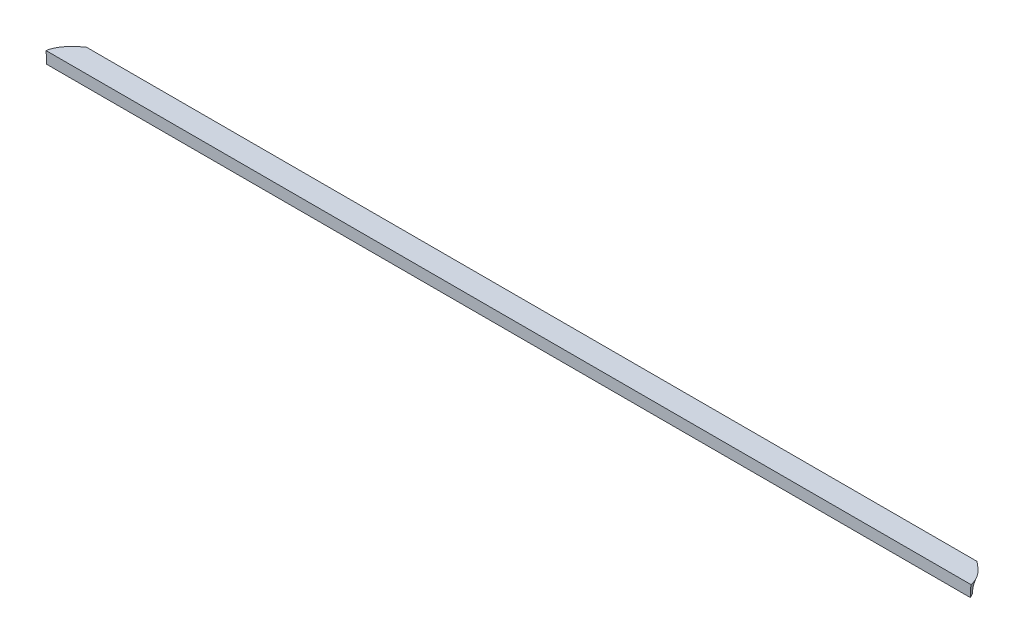
ISO-10303-21;
HEADER;
FILE_DESCRIPTION(('STEP AP214'),'2;1');
FILE_NAME('part.step','',(''),(''),'','','');
FILE_SCHEMA(('AUTOMOTIVE_DESIGN { 1 0 10303 214 1 1 1 1 }'));
ENDSEC;
DATA;
#1=APPLICATION_CONTEXT('core data for automotive mechanical design processes');
#2=APPLICATION_PROTOCOL_DEFINITION('international standard','automotive_design',2000,#1);
#3=PRODUCT_CONTEXT('',#1,'mechanical');
#4=PRODUCT('Part','Part','',(#3));
#5=PRODUCT_RELATED_PRODUCT_CATEGORY('part','',(#4));
#6=PRODUCT_DEFINITION_FORMATION('','',#4);
#7=PRODUCT_DEFINITION_CONTEXT('part definition',#1,'design');
#8=PRODUCT_DEFINITION('design','',#6,#7);
#9=PRODUCT_DEFINITION_SHAPE('','',#8);
#10=(LENGTH_UNIT() NAMED_UNIT(*) SI_UNIT(.MILLI.,.METRE.));
#11=(NAMED_UNIT(*) PLANE_ANGLE_UNIT() SI_UNIT($,.RADIAN.));
#12=(NAMED_UNIT(*) SI_UNIT($,.STERADIAN.) SOLID_ANGLE_UNIT());
#13=UNCERTAINTY_MEASURE_WITH_UNIT(LENGTH_MEASURE(1.E-05),#10,'distance_accuracy_value','');
#14=(GEOMETRIC_REPRESENTATION_CONTEXT(3) GLOBAL_UNCERTAINTY_ASSIGNED_CONTEXT((#13)) GLOBAL_UNIT_ASSIGNED_CONTEXT((#10,
#11,#12)) REPRESENTATION_CONTEXT('',''));
#15=CARTESIAN_POINT('',(0.,0.,0.));
#16=DIRECTION('',(0.,0.,1.));
#17=DIRECTION('',(1.,0.,0.));
#18=AXIS2_PLACEMENT_3D('',#15,#16,#17);
#19=CARTESIAN_POINT('',(-66.9058147928889,-2.,86.9637403470439));
#20=DIRECTION('',(1.,0.,0.));
#21=DIRECTION('',(0.,0.,-1.));
#22=AXIS2_PLACEMENT_3D('',#19,#20,#21);
#23=TOROIDAL_SURFACE('',#22,5.,3.);
#24=CARTESIAN_POINT('',(-69.9058147928889,0.999999999999997,90.9637403470439));
#25=CARTESIAN_POINT('',(-69.9058147928889,0.666480845146401,90.9637403470439));
#26=CARTESIAN_POINT('',(-69.877525242366,0.249164802214041,90.9637403470439));
#27=CARTESIAN_POINT('',(-69.8625755166707,0.0286324765040209,90.9637403470439));
#28=CARTESIAN_POINT('',(-69.8161638643568,-0.499778986061336,90.9637403470439));
#29=CARTESIAN_POINT('',(-69.7745955767013,-0.97304719741045,90.9637403470439));
#30=CARTESIAN_POINT('',(-69.7579941469615,-1.24890530846617,90.9637403470439));
#31=CARTESIAN_POINT('',(-69.7342419176351,-1.64358487631128,90.9637403470439));
#32=CARTESIAN_POINT('',(-69.7342419176351,-2.,90.9637403470439));
#33=B_SPLINE_CURVE_WITH_KNOTS('',2,(#24,#25,#26,#27,#28,#29,#30,#31,#32),.UNSPECIFIED.,.F.,.F.,
(3,2,2,2,3),(0.,0.25,0.5,0.75,1.),.UNSPECIFIED.);
#34=CARTESIAN_POINT('',(-69.8588030308181,3.01634316265606E-06,90.9635936772338));
#35=VERTEX_POINT('',#34);
#36=CARTESIAN_POINT('',(-69.7342419176351,-2.,90.9637403470439));
#37=VERTEX_POINT('',#36);
#38=EDGE_CURVE('E107',#35,#37,#33,.T.);
#39=ORIENTED_EDGE('',*,*,#38,.F.);
#40=CARTESIAN_POINT('',(-66.9058147928889,0.,86.9637403470439));
#41=CARTESIAN_POINT('',(-66.9086431982653,0.,86.9660497223522));
#42=CARTESIAN_POINT('',(-66.9114716255801,0.,86.9683591236709));
#43=CARTESIAN_POINT('',(-67.2821647550378,-4.64391994805597E-13,87.271032105808));
#44=CARTESIAN_POINT('',(-67.6502473120726,-1.01863606319856E-13,87.5719992009598));
#45=CARTESIAN_POINT('',(-68.1724523069411,0.,88.0559403173067));
#46=CARTESIAN_POINT('',(-68.3413779735427,0.,88.2224838102194));
#47=CARTESIAN_POINT('',(-68.6633705358107,0.,88.5700854873986));
#48=CARTESIAN_POINT('',(-68.8164560081418,0.,88.7511262174139));
#49=CARTESIAN_POINT('',(-69.1045977383734,0.,89.1357253248787));
#50=CARTESIAN_POINT('',(-69.2390069899249,0.,89.3397824035791));
#51=CARTESIAN_POINT('',(-69.4170017387718,0.,89.6587788868157));
#52=CARTESIAN_POINT('',(-69.4723766370238,0.,89.7672097182169));
#53=CARTESIAN_POINT('',(-69.5743527906943,0.,89.9881009368391));
#54=CARTESIAN_POINT('',(-69.6209578239052,0.,90.1005595640424));
#55=CARTESIAN_POINT('',(-69.7047058088721,0.,90.3296983113748));
#56=CARTESIAN_POINT('',(-69.7417926905651,0.,90.4463990227005));
#57=CARTESIAN_POINT('',(-69.8052486582005,0.,90.6826604533447));
#58=CARTESIAN_POINT('',(-69.8316208474269,0.,90.8022203339274));
#59=CARTESIAN_POINT('',(-69.8730632182671,0.,91.0446109353093));
#60=CARTESIAN_POINT('',(-69.8880109544736,0.,91.1674628733767));
#61=CARTESIAN_POINT('',(-69.9054859797905,0.,91.4142054398523));
#62=CARTESIAN_POINT('',(-69.9079963230803,0.,91.5380972551425));
#63=CARTESIAN_POINT('',(-69.9039384310851,0.,91.6618393249836));
#64=B_SPLINE_CURVE_WITH_KNOTS('',3,(#40,#41,#42,#43,#44,#45,#46,#47,#48,#49,#50,#51,#52,#53,#54,
#55,#56,#57,#58,#59,#60,#61,#62,#63),.UNSPECIFIED.,.F.,.F.,(4,2,2,2,2,2,2,2,2,2,2,4),(0.,
0.0109544511501086,1.4356816827656,2.14660492174934,2.85668474027996,3.58723574257017,
3.95217376099224,4.31695421347691,4.68383661237107,5.05061267566349,5.4212666987021,
5.7924255954428),.UNSPECIFIED.);
#65=CARTESIAN_POINT('',(-66.9058147928889,0.,86.9637403470439));
#66=VERTEX_POINT('',#65);
#67=EDGE_CURVE('E95',#35,#66,#64,.F.);
#68=ORIENTED_EDGE('',*,*,#67,.T.);
#69=CARTESIAN_POINT('',(-66.9058147928889,-2.,86.9637403470439));
#70=DIRECTION('',(1.,0.,0.));
#71=DIRECTION('',(0.,0.,-1.));
#72=AXIS2_PLACEMENT_3D('',#69,#70,#71);
#73=CIRCLE('',#72,2.);
#74=CARTESIAN_POINT('',(-66.9058147928889,-2.,88.9637403470439));
#75=VERTEX_POINT('',#74);
#76=EDGE_CURVE('E159',#75,#66,#73,.F.);
#77=ORIENTED_EDGE('',*,*,#76,.F.);
#78=CARTESIAN_POINT('',(-66.9058147928889,-2.,91.9637403470439));
#79=DIRECTION('',(0.,-1.,0.));
#80=DIRECTION('',(0.,0.,-1.));
#81=AXIS2_PLACEMENT_3D('',#78,#79,#80);
#82=CIRCLE('',#81,3.);
#83=EDGE_CURVE('E112',#37,#75,#82,.T.);
#84=ORIENTED_EDGE('',*,*,#83,.F.);
#85=EDGE_LOOP('',(#39,#68,#77,#84));
#86=FACE_BOUND('',#85,.T.);
#87=ADVANCED_FACE('F52',(#86),#23,.T.);
#88=CARTESIAN_POINT('',(87.0941852071111,-2.,86.9637403470439));
#89=DIRECTION('',(1.,0.,0.));
#90=DIRECTION('',(0.,0.,-1.));
#91=AXIS2_PLACEMENT_3D('',#88,#89,#90);
#92=TOROIDAL_SURFACE('',#91,5.,3.);
#93=CARTESIAN_POINT('',(87.0941852071111,-2.,86.9637403470439));
#94=DIRECTION('',(1.,0.,0.));
#95=DIRECTION('',(0.,0.,-1.));
#96=AXIS2_PLACEMENT_3D('',#93,#94,#95);
#97=CIRCLE('',#96,2.);
#98=CARTESIAN_POINT('',(87.0941852071111,0.,86.9637403470439));
#99=VERTEX_POINT('',#98);
#100=CARTESIAN_POINT('',(87.0941852071111,-2.,88.9637403470439));
#101=VERTEX_POINT('',#100);
#102=EDGE_CURVE('E114',#99,#101,#97,.T.);
#103=ORIENTED_EDGE('',*,*,#102,.F.);
#104=CARTESIAN_POINT('',(87.0941852071111,0.,86.9637403470439));
#105=CARTESIAN_POINT('',(87.0970136124876,0.,86.9660497223521));
#106=CARTESIAN_POINT('',(87.0998420398025,0.,86.9683591236707));
#107=CARTESIAN_POINT('',(87.470535169298,-4.28412513847068E-13,87.2710321058178));
#108=CARTESIAN_POINT('',(87.8386177263519,0.,87.5719992010026));
#109=CARTESIAN_POINT('',(88.3608227212522,0.,88.0559403173941));
#110=CARTESIAN_POINT('',(88.529748387865,0.,88.2224838103208));
#111=CARTESIAN_POINT('',(88.8517409501504,0.,88.570085487532));
#112=CARTESIAN_POINT('',(89.004826422488,0.,88.7511262175651));
#113=CARTESIAN_POINT('',(89.2929681527081,0.,89.1357253250434));
#114=CARTESIAN_POINT('',(89.4273774042448,0.,89.3397824037369));
#115=CARTESIAN_POINT('',(89.6053721530706,0.,89.6587788869614));
#116=CARTESIAN_POINT('',(89.6607470513157,0.,89.7672097183583));
#117=CARTESIAN_POINT('',(89.7627232049731,0.,89.9881009369711));
#118=CARTESIAN_POINT('',(89.8093282381778,0.,90.1005595641693));
#119=CARTESIAN_POINT('',(89.8930762231328,0.,90.3296983114908));
#120=CARTESIAN_POINT('',(89.9301631048203,0.,90.4463990228107));
#121=CARTESIAN_POINT('',(89.9936190724457,0.,90.6826604534425));
#122=CARTESIAN_POINT('',(90.0199912616675,0.,90.8022203340187));
#123=CARTESIAN_POINT('',(90.0614336324999,0.,91.0446109353874));
#124=CARTESIAN_POINT('',(90.0763813687031,0.,91.1674628734479));
#125=CARTESIAN_POINT('',(90.0938563940147,0.,91.4142054399093));
#126=CARTESIAN_POINT('',(90.0963667373024,0.,91.5380972551923));
#127=CARTESIAN_POINT('',(90.092308845306,0.,91.6618393250261));
#128=B_SPLINE_CURVE_WITH_KNOTS('',3,(#104,#105,#106,#107,#108,#109,#110,#111,#112,#113,#114,
#115,#116,#117,#118,#119,#120,#121,#122,#123,#124,#125,#126,#127),.UNSPECIFIED.,.F.,.F.,(4,2,2,
2,2,2,2,2,2,2,2,4),(0.,0.010954451150107,1.43568168287213,2.1466049219094,2.85668474049265,
3.58723574274155,3.95217376114254,4.3169542136062,4.68383661247854,5.05061267574919,
5.42126669876623,5.7924255954852),.UNSPECIFIED.);
#129=CARTESIAN_POINT('',(90.0471732960644,1.1617651608526E-06,90.9635936777336));
#130=VERTEX_POINT('',#129);
#131=EDGE_CURVE('E13',#99,#130,#128,.T.);
#132=ORIENTED_EDGE('',*,*,#131,.T.);
#133=CARTESIAN_POINT('',(89.9226123318573,-2.,90.9637403470438));
#134=CARTESIAN_POINT('',(89.9226123318573,-1.64358487631081,90.9637403470438));
#135=CARTESIAN_POINT('',(89.9463645611837,-1.24890530846617,90.9637403470438));
#136=CARTESIAN_POINT('',(89.9629659909236,-0.973047197410887,90.9637403470438));
#137=CARTESIAN_POINT('',(90.004534278579,-0.499778986061329,90.9637403470438));
#138=CARTESIAN_POINT('',(90.0509459308931,0.0286324765053324,90.9637403470438));
#139=CARTESIAN_POINT('',(90.0658956565883,0.249164802214055,90.9637403470438));
#140=CARTESIAN_POINT('',(90.0941852071111,0.666480845145999,90.9637403470438));
#141=CARTESIAN_POINT('',(90.0941852071111,1.00000000000001,90.9637403470438));
#142=B_SPLINE_CURVE_WITH_KNOTS('',2,(#133,#134,#135,#136,#137,#138,#139,#140,#141),
.UNSPECIFIED.,.F.,.F.,(3,2,2,2,3),(0.,0.25,0.5,0.75,1.),.UNSPECIFIED.);
#143=CARTESIAN_POINT('',(89.9226123318573,-2.,90.9637403470439));
#144=VERTEX_POINT('',#143);
#145=EDGE_CURVE('E62',#144,#130,#142,.T.);
#146=ORIENTED_EDGE('',*,*,#145,.F.);
#147=CARTESIAN_POINT('',(87.0941852071111,-2.,91.9637403470439));
#148=DIRECTION('',(0.,-1.,0.));
#149=DIRECTION('',(0.,0.,-1.));
#150=AXIS2_PLACEMENT_3D('',#147,#148,#149);
#151=CIRCLE('',#150,3.);
#152=EDGE_CURVE('E77',#101,#144,#151,.T.);
#153=ORIENTED_EDGE('',*,*,#152,.F.);
#154=EDGE_LOOP('',(#103,#132,#146,#153));
#155=FACE_BOUND('',#154,.T.);
#156=ADVANCED_FACE('F142',(#155),#92,.T.);
#157=CARTESIAN_POINT('',(-69.9058147928889,19.5,90.9637403470439));
#158=DIRECTION('',(0.,0.,-1.));
#159=DIRECTION('',(-1.,0.,0.));
#160=AXIS2_PLACEMENT_3D('',#157,#158,#159);
#161=PLANE('',#160);
#162=ORIENTED_EDGE('',*,*,#145,.T.);
#163=DIRECTION('',(-1.,0.,0.));
#164=VECTOR('',#163,1.);
#165=CARTESIAN_POINT('',(0.,0.,90.9637403470439));
#166=LINE('',#165,#164);
#167=EDGE_CURVE('E70',#130,#35,#166,.T.);
#168=ORIENTED_EDGE('',*,*,#167,.T.);
#169=ORIENTED_EDGE('',*,*,#38,.T.);
#170=DIRECTION('',(1.,0.,0.));
#171=VECTOR('',#170,1.);
#172=CARTESIAN_POINT('',(0.,-2.,90.9637403470439));
#173=LINE('',#172,#171);
#174=EDGE_CURVE('E102',#37,#144,#173,.T.);
#175=ORIENTED_EDGE('',*,*,#174,.T.);
#176=EDGE_LOOP('',(#162,#168,#169,#175));
#177=FACE_BOUND('',#176,.T.);
#178=ADVANCED_FACE('F106',(#177),#161,.F.);
#179=CARTESIAN_POINT('',(0.,-2.,88.9637403470439));
#180=DIRECTION('',(0.,-1.,0.));
#181=DIRECTION('',(0.,0.,-1.));
#182=AXIS2_PLACEMENT_3D('',#179,#180,#181);
#183=PLANE('',#182);
#184=DIRECTION('',(1.,0.,0.));
#185=VECTOR('',#184,1.);
#186=CARTESIAN_POINT('',(0.,-2.,88.9637403470439));
#187=LINE('',#186,#185);
#188=EDGE_CURVE('E124',#75,#101,#187,.T.);
#189=ORIENTED_EDGE('',*,*,#188,.T.);
#190=ORIENTED_EDGE('',*,*,#152,.T.);
#191=ORIENTED_EDGE('',*,*,#174,.F.);
#192=ORIENTED_EDGE('',*,*,#83,.T.);
#193=EDGE_LOOP('',(#189,#190,#191,#192));
#194=FACE_BOUND('',#193,.T.);
#195=ADVANCED_FACE('F141',(#194),#183,.T.);
#196=CARTESIAN_POINT('',(0.,-2.,86.9637403470439));
#197=DIRECTION('',(1.,0.,0.));
#198=DIRECTION('',(0.,0.,-1.));
#199=AXIS2_PLACEMENT_3D('',#196,#197,#198);
#200=CYLINDRICAL_SURFACE('',#199,2.);
#201=DIRECTION('',(1.,0.,0.));
#202=VECTOR('',#201,1.);
#203=CARTESIAN_POINT('',(0.,0.,86.9637403470439));
#204=LINE('',#203,#202);
#205=EDGE_CURVE('E98',#99,#66,#204,.F.);
#206=ORIENTED_EDGE('',*,*,#205,.F.);
#207=ORIENTED_EDGE('',*,*,#102,.T.);
#208=ORIENTED_EDGE('',*,*,#188,.F.);
#209=ORIENTED_EDGE('',*,*,#76,.T.);
#210=EDGE_LOOP('',(#206,#207,#208,#209));
#211=FACE_BOUND('',#210,.T.);
#212=ADVANCED_FACE('F144',(#211),#200,.F.);
#213=CARTESIAN_POINT('',(0.,0.,-70.0362596529561));
#214=DIRECTION('',(0.,1.,0.));
#215=DIRECTION('',(-1.,0.,0.));
#216=AXIS2_PLACEMENT_3D('',#213,#214,#215);
#217=PLANE('',#216);
#218=ORIENTED_EDGE('',*,*,#167,.F.);
#219=ORIENTED_EDGE('',*,*,#131,.F.);
#220=ORIENTED_EDGE('',*,*,#205,.T.);
#221=ORIENTED_EDGE('',*,*,#67,.F.);
#222=EDGE_LOOP('',(#218,#219,#220,#221));
#223=FACE_BOUND('',#222,.T.);
#224=ADVANCED_FACE('F96',(#223),#217,.T.);
#225=CLOSED_SHELL('',(#87,#156,#178,#195,#212,#224));
#226=MANIFOLD_SOLID_BREP('B2',#225);
#227=ADVANCED_BREP_SHAPE_REPRESENTATION('',(#18,#226),#14);
#228=SHAPE_DEFINITION_REPRESENTATION(#9,#227);
ENDSEC;
END-ISO-10303-21;
